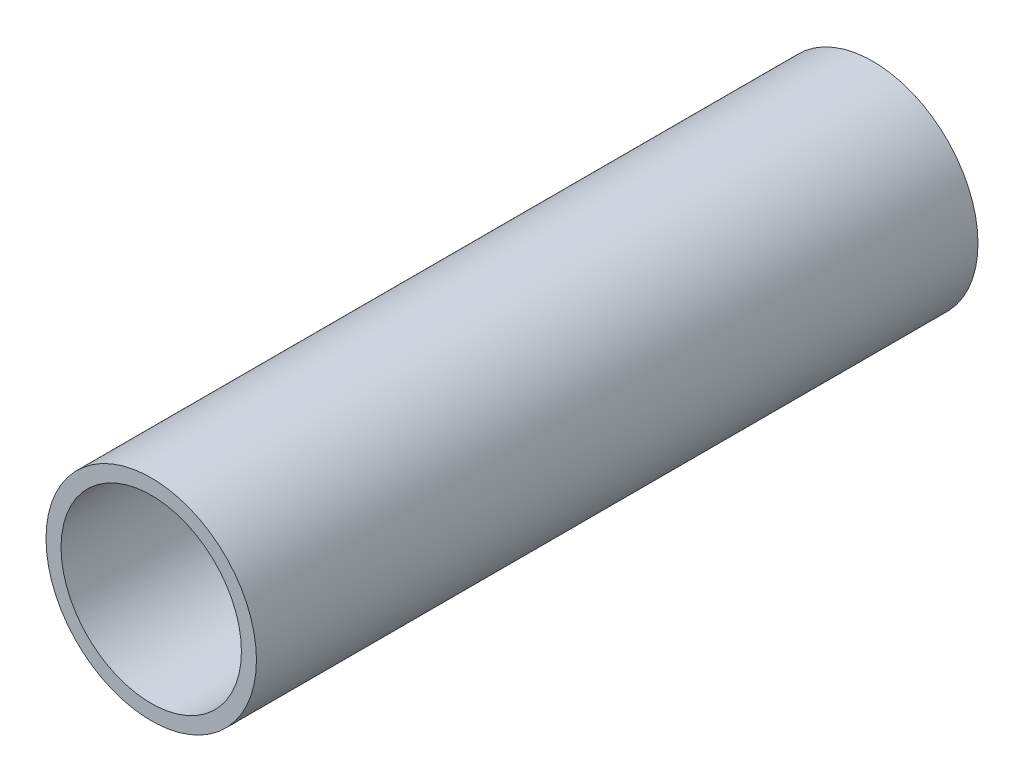
ISO-10303-21;
HEADER;
FILE_DESCRIPTION(('STEP AP214'),'2;1');
FILE_NAME('part.step','',(''),(''),'','','');
FILE_SCHEMA(('AUTOMOTIVE_DESIGN { 1 0 10303 214 1 1 1 1 }'));
ENDSEC;
DATA;
#1=APPLICATION_CONTEXT('core data for automotive mechanical design processes');
#2=APPLICATION_PROTOCOL_DEFINITION('international standard','automotive_design',2000,#1);
#3=PRODUCT_CONTEXT('',#1,'mechanical');
#4=PRODUCT('Part','Part','',(#3));
#5=PRODUCT_RELATED_PRODUCT_CATEGORY('part','',(#4));
#6=PRODUCT_DEFINITION_FORMATION('','',#4);
#7=PRODUCT_DEFINITION_CONTEXT('part definition',#1,'design');
#8=PRODUCT_DEFINITION('design','',#6,#7);
#9=PRODUCT_DEFINITION_SHAPE('','',#8);
#10=(LENGTH_UNIT() NAMED_UNIT(*) SI_UNIT(.MILLI.,.METRE.));
#11=(NAMED_UNIT(*) PLANE_ANGLE_UNIT() SI_UNIT($,.RADIAN.));
#12=(NAMED_UNIT(*) SI_UNIT($,.STERADIAN.) SOLID_ANGLE_UNIT());
#13=UNCERTAINTY_MEASURE_WITH_UNIT(LENGTH_MEASURE(1.E-05),#10,'distance_accuracy_value','');
#14=(GEOMETRIC_REPRESENTATION_CONTEXT(3) GLOBAL_UNCERTAINTY_ASSIGNED_CONTEXT((#13)) GLOBAL_UNIT_ASSIGNED_CONTEXT((#10,
#11,#12)) REPRESENTATION_CONTEXT('',''));
#15=CARTESIAN_POINT('',(0.,0.,0.));
#16=DIRECTION('',(0.,0.,1.));
#17=DIRECTION('',(1.,0.,0.));
#18=AXIS2_PLACEMENT_3D('',#15,#16,#17);
#19=CARTESIAN_POINT('',(0.,0.,304.8));
#20=DIRECTION('',(0.,0.,1.));
#21=DIRECTION('',(1.,0.,0.));
#22=AXIS2_PLACEMENT_3D('',#19,#20,#21);
#23=PLANE('',#22);
#24=CARTESIAN_POINT('',(0.,0.,304.8));
#25=DIRECTION('',(0.,0.,1.));
#26=DIRECTION('',(1.,0.,0.));
#27=AXIS2_PLACEMENT_3D('',#24,#25,#26);
#28=CIRCLE('',#27,44.45);
#29=CARTESIAN_POINT('',(-44.45,0.,304.8));
#30=VERTEX_POINT('',#29);
#31=EDGE_CURVE('E10',#30,#30,#28,.T.);
#32=ORIENTED_EDGE('',*,*,#31,.T.);
#33=EDGE_LOOP('',(#32));
#34=FACE_BOUND('',#33,.T.);
#35=CARTESIAN_POINT('',(0.,0.,304.8));
#36=DIRECTION('',(0.,0.,1.));
#37=DIRECTION('',(1.,0.,0.));
#38=AXIS2_PLACEMENT_3D('',#35,#36,#37);
#39=CIRCLE('',#38,38.1);
#40=CARTESIAN_POINT('',(-38.1,0.,304.8));
#41=VERTEX_POINT('',#40);
#42=EDGE_CURVE('E44',#41,#41,#39,.T.);
#43=ORIENTED_EDGE('',*,*,#42,.F.);
#44=EDGE_LOOP('',(#43));
#45=FACE_BOUND('',#44,.T.);
#46=ADVANCED_FACE('F33',(#34,#45),#23,.T.);
#47=CARTESIAN_POINT('',(0.,0.,0.));
#48=DIRECTION('',(0.,0.,1.));
#49=DIRECTION('',(1.,0.,0.));
#50=AXIS2_PLACEMENT_3D('',#47,#48,#49);
#51=PLANE('',#50);
#52=CARTESIAN_POINT('',(0.,0.,0.));
#53=DIRECTION('',(0.,0.,1.));
#54=DIRECTION('',(1.,0.,0.));
#55=AXIS2_PLACEMENT_3D('',#52,#53,#54);
#56=CIRCLE('',#55,44.45);
#57=CARTESIAN_POINT('',(-44.45,0.,0.));
#58=VERTEX_POINT('',#57);
#59=EDGE_CURVE('E37',#58,#58,#56,.T.);
#60=ORIENTED_EDGE('',*,*,#59,.F.);
#61=EDGE_LOOP('',(#60));
#62=FACE_BOUND('',#61,.T.);
#63=CARTESIAN_POINT('',(0.,0.,0.));
#64=DIRECTION('',(0.,0.,1.));
#65=DIRECTION('',(1.,0.,0.));
#66=AXIS2_PLACEMENT_3D('',#63,#64,#65);
#67=CIRCLE('',#66,38.1);
#68=CARTESIAN_POINT('',(-38.1,0.,0.));
#69=VERTEX_POINT('',#68);
#70=EDGE_CURVE('E46',#69,#69,#67,.T.);
#71=ORIENTED_EDGE('',*,*,#70,.T.);
#72=EDGE_LOOP('',(#71));
#73=FACE_BOUND('',#72,.T.);
#74=ADVANCED_FACE('F56',(#62,#73),#51,.F.);
#75=CARTESIAN_POINT('',(0.,0.,304.8));
#76=DIRECTION('',(0.,0.,-1.));
#77=DIRECTION('',(-1.,0.,0.));
#78=AXIS2_PLACEMENT_3D('',#75,#76,#77);
#79=CYLINDRICAL_SURFACE('',#78,44.45);
#80=CARTESIAN_POINT('',(-44.45,0.,304.8));
#81=CARTESIAN_POINT('',(-44.45,0.,301.625));
#82=CARTESIAN_POINT('',(-44.45,0.,298.45));
#83=CARTESIAN_POINT('',(-44.45,0.,292.1));
#84=CARTESIAN_POINT('',(-44.45,0.,288.925));
#85=CARTESIAN_POINT('',(-44.45,0.,282.575));
#86=CARTESIAN_POINT('',(-44.45,0.,279.4));
#87=CARTESIAN_POINT('',(-44.45,0.,273.05));
#88=CARTESIAN_POINT('',(-44.45,0.,269.875));
#89=CARTESIAN_POINT('',(-44.45,0.,263.525));
#90=CARTESIAN_POINT('',(-44.45,0.,260.35));
#91=CARTESIAN_POINT('',(-44.45,0.,254.));
#92=CARTESIAN_POINT('',(-44.45,0.,250.825));
#93=CARTESIAN_POINT('',(-44.45,0.,244.475));
#94=CARTESIAN_POINT('',(-44.45,0.,241.3));
#95=CARTESIAN_POINT('',(-44.45,0.,234.95));
#96=CARTESIAN_POINT('',(-44.45,0.,231.775));
#97=CARTESIAN_POINT('',(-44.45,0.,225.425));
#98=CARTESIAN_POINT('',(-44.45,0.,222.25));
#99=CARTESIAN_POINT('',(-44.45,0.,215.9));
#100=CARTESIAN_POINT('',(-44.45,0.,212.725));
#101=CARTESIAN_POINT('',(-44.45,0.,206.375));
#102=CARTESIAN_POINT('',(-44.45,0.,203.2));
#103=CARTESIAN_POINT('',(-44.45,0.,196.85));
#104=CARTESIAN_POINT('',(-44.45,0.,193.675));
#105=CARTESIAN_POINT('',(-44.45,0.,187.325));
#106=CARTESIAN_POINT('',(-44.45,0.,184.15));
#107=CARTESIAN_POINT('',(-44.45,0.,177.8));
#108=CARTESIAN_POINT('',(-44.45,0.,174.625));
#109=CARTESIAN_POINT('',(-44.45,0.,168.275));
#110=CARTESIAN_POINT('',(-44.45,0.,165.1));
#111=CARTESIAN_POINT('',(-44.45,0.,158.75));
#112=CARTESIAN_POINT('',(-44.45,0.,155.575));
#113=CARTESIAN_POINT('',(-44.45,0.,149.225));
#114=CARTESIAN_POINT('',(-44.45,0.,146.05));
#115=CARTESIAN_POINT('',(-44.45,0.,139.7));
#116=CARTESIAN_POINT('',(-44.45,0.,136.525));
#117=CARTESIAN_POINT('',(-44.45,0.,130.175));
#118=CARTESIAN_POINT('',(-44.45,0.,127.));
#119=CARTESIAN_POINT('',(-44.45,0.,120.65));
#120=CARTESIAN_POINT('',(-44.45,0.,117.475));
#121=CARTESIAN_POINT('',(-44.45,0.,111.125));
#122=CARTESIAN_POINT('',(-44.45,0.,107.95));
#123=CARTESIAN_POINT('',(-44.45,0.,101.6));
#124=CARTESIAN_POINT('',(-44.45,0.,98.425));
#125=CARTESIAN_POINT('',(-44.45,0.,92.075));
#126=CARTESIAN_POINT('',(-44.45,0.,88.9));
#127=CARTESIAN_POINT('',(-44.45,0.,82.55));
#128=CARTESIAN_POINT('',(-44.45,0.,79.375));
#129=CARTESIAN_POINT('',(-44.45,0.,73.025));
#130=CARTESIAN_POINT('',(-44.45,0.,69.85));
#131=CARTESIAN_POINT('',(-44.45,0.,63.5));
#132=CARTESIAN_POINT('',(-44.45,0.,60.325));
#133=CARTESIAN_POINT('',(-44.45,0.,53.975));
#134=CARTESIAN_POINT('',(-44.45,0.,50.8));
#135=CARTESIAN_POINT('',(-44.45,0.,44.45));
#136=CARTESIAN_POINT('',(-44.45,0.,41.275));
#137=CARTESIAN_POINT('',(-44.45,0.,34.925));
#138=CARTESIAN_POINT('',(-44.45,0.,31.75));
#139=CARTESIAN_POINT('',(-44.45,0.,25.4));
#140=CARTESIAN_POINT('',(-44.45,0.,22.225));
#141=CARTESIAN_POINT('',(-44.45,0.,15.875));
#142=CARTESIAN_POINT('',(-44.45,0.,12.7));
#143=CARTESIAN_POINT('',(-44.45,0.,6.35));
#144=CARTESIAN_POINT('',(-44.45,0.,3.175));
#145=CARTESIAN_POINT('',(-44.45,0.,0.));
#146=B_SPLINE_CURVE_WITH_KNOTS('',3,(#80,#81,#82,#83,#84,#85,#86,#87,#88,#89,#90,#91,#92,#93,
#94,#95,#96,#97,#98,#99,#100,#101,#102,#103,#104,#105,#106,#107,#108,#109,#110,#111,#112,#113,
#114,#115,#116,#117,#118,#119,#120,#121,#122,#123,#124,#125,#126,#127,#128,#129,#130,#131,#132,
#133,#134,#135,#136,#137,#138,#139,#140,#141,#142,#143,#144,#145),.UNSPECIFIED.,.F.,.F.,(4,2,2,
2,2,2,2,2,2,2,2,2,2,2,2,2,2,2,2,2,2,2,2,2,2,2,2,2,2,2,2,2,4),(0.,9.52499999999995,19.05,28.575,
38.1,47.625,57.15,66.675,76.2,85.725,95.2499999999999,104.775,114.3,123.825,133.35,142.875,
152.4,161.925,171.45,180.975,190.5,200.025,209.55,219.075,228.6,238.125,247.65,257.175,266.7,
276.225,285.75,295.275,304.8),.UNSPECIFIED.);
#147=EDGE_CURVE('BSEAM35',#30,#58,#146,.T.);
#148=ORIENTED_EDGE('',*,*,#31,.F.);
#149=ORIENTED_EDGE('',*,*,#59,.T.);
#150=ORIENTED_EDGE('',*,*,#147,.T.);
#151=ORIENTED_EDGE('',*,*,#147,.F.);
#152=EDGE_LOOP('',(#148,#150,#149,#151));
#153=FACE_BOUND('',#152,.T.);
#154=ADVANCED_FACE('F35',(#153),#79,.T.);
#155=CARTESIAN_POINT('',(0.,0.,304.8));
#156=DIRECTION('',(0.,0.,-1.));
#157=DIRECTION('',(-1.,0.,0.));
#158=AXIS2_PLACEMENT_3D('',#155,#156,#157);
#159=CYLINDRICAL_SURFACE('',#158,38.1);
#160=CARTESIAN_POINT('',(-38.1,0.,304.8));
#161=CARTESIAN_POINT('',(-38.1,0.,301.625));
#162=CARTESIAN_POINT('',(-38.1,0.,298.45));
#163=CARTESIAN_POINT('',(-38.1,0.,292.1));
#164=CARTESIAN_POINT('',(-38.1,0.,288.925));
#165=CARTESIAN_POINT('',(-38.1,0.,282.575));
#166=CARTESIAN_POINT('',(-38.1,0.,279.4));
#167=CARTESIAN_POINT('',(-38.1,0.,273.05));
#168=CARTESIAN_POINT('',(-38.1,0.,269.875));
#169=CARTESIAN_POINT('',(-38.1,0.,263.525));
#170=CARTESIAN_POINT('',(-38.1,0.,260.35));
#171=CARTESIAN_POINT('',(-38.1,0.,254.));
#172=CARTESIAN_POINT('',(-38.1,0.,250.825));
#173=CARTESIAN_POINT('',(-38.1,0.,244.475));
#174=CARTESIAN_POINT('',(-38.1,0.,241.3));
#175=CARTESIAN_POINT('',(-38.1,0.,234.95));
#176=CARTESIAN_POINT('',(-38.1,0.,231.775));
#177=CARTESIAN_POINT('',(-38.1,0.,225.425));
#178=CARTESIAN_POINT('',(-38.1,0.,222.25));
#179=CARTESIAN_POINT('',(-38.1,0.,215.9));
#180=CARTESIAN_POINT('',(-38.1,0.,212.725));
#181=CARTESIAN_POINT('',(-38.1,0.,206.375));
#182=CARTESIAN_POINT('',(-38.1,0.,203.2));
#183=CARTESIAN_POINT('',(-38.1,0.,196.85));
#184=CARTESIAN_POINT('',(-38.1,0.,193.675));
#185=CARTESIAN_POINT('',(-38.1,0.,187.325));
#186=CARTESIAN_POINT('',(-38.1,0.,184.15));
#187=CARTESIAN_POINT('',(-38.1,0.,177.8));
#188=CARTESIAN_POINT('',(-38.1,0.,174.625));
#189=CARTESIAN_POINT('',(-38.1,0.,168.275));
#190=CARTESIAN_POINT('',(-38.1,0.,165.1));
#191=CARTESIAN_POINT('',(-38.1,0.,158.75));
#192=CARTESIAN_POINT('',(-38.1,0.,155.575));
#193=CARTESIAN_POINT('',(-38.1,0.,149.225));
#194=CARTESIAN_POINT('',(-38.1,0.,146.05));
#195=CARTESIAN_POINT('',(-38.1,0.,139.7));
#196=CARTESIAN_POINT('',(-38.1,0.,136.525));
#197=CARTESIAN_POINT('',(-38.1,0.,130.175));
#198=CARTESIAN_POINT('',(-38.1,0.,127.));
#199=CARTESIAN_POINT('',(-38.1,0.,120.65));
#200=CARTESIAN_POINT('',(-38.1,0.,117.475));
#201=CARTESIAN_POINT('',(-38.1,0.,111.125));
#202=CARTESIAN_POINT('',(-38.1,0.,107.95));
#203=CARTESIAN_POINT('',(-38.1,0.,101.6));
#204=CARTESIAN_POINT('',(-38.1,0.,98.425));
#205=CARTESIAN_POINT('',(-38.1,0.,92.075));
#206=CARTESIAN_POINT('',(-38.1,0.,88.9));
#207=CARTESIAN_POINT('',(-38.1,0.,82.55));
#208=CARTESIAN_POINT('',(-38.1,0.,79.375));
#209=CARTESIAN_POINT('',(-38.1,0.,73.025));
#210=CARTESIAN_POINT('',(-38.1,0.,69.85));
#211=CARTESIAN_POINT('',(-38.1,0.,63.5));
#212=CARTESIAN_POINT('',(-38.1,0.,60.325));
#213=CARTESIAN_POINT('',(-38.1,0.,53.975));
#214=CARTESIAN_POINT('',(-38.1,0.,50.8));
#215=CARTESIAN_POINT('',(-38.1,0.,44.45));
#216=CARTESIAN_POINT('',(-38.1,0.,41.275));
#217=CARTESIAN_POINT('',(-38.1,0.,34.925));
#218=CARTESIAN_POINT('',(-38.1,0.,31.75));
#219=CARTESIAN_POINT('',(-38.1,0.,25.4));
#220=CARTESIAN_POINT('',(-38.1,0.,22.225));
#221=CARTESIAN_POINT('',(-38.1,0.,15.875));
#222=CARTESIAN_POINT('',(-38.1,0.,12.7));
#223=CARTESIAN_POINT('',(-38.1,0.,6.35));
#224=CARTESIAN_POINT('',(-38.1,0.,3.175));
#225=CARTESIAN_POINT('',(-38.1,0.,0.));
#226=B_SPLINE_CURVE_WITH_KNOTS('',3,(#160,#161,#162,#163,#164,#165,#166,#167,#168,#169,#170,
#171,#172,#173,#174,#175,#176,#177,#178,#179,#180,#181,#182,#183,#184,#185,#186,#187,#188,#189,
#190,#191,#192,#193,#194,#195,#196,#197,#198,#199,#200,#201,#202,#203,#204,#205,#206,#207,#208,
#209,#210,#211,#212,#213,#214,#215,#216,#217,#218,#219,#220,#221,#222,#223,#224,#225),
.UNSPECIFIED.,.F.,.F.,(4,2,2,2,2,2,2,2,2,2,2,2,2,2,2,2,2,2,2,2,2,2,2,2,2,2,2,2,2,2,2,2,4),(0.,
9.52500000000001,19.05,28.575,38.1,47.625,57.15,66.675,76.2,85.7250000000001,95.2500000000001,
104.775,114.3,123.825,133.35,142.875,152.4,161.925,171.45,180.975,190.5,200.025,209.55,219.075,
228.6,238.125,247.65,257.175,266.7,276.225,285.75,295.275,304.8),.UNSPECIFIED.);
#227=EDGE_CURVE('BSEAM52',#41,#69,#226,.T.);
#228=ORIENTED_EDGE('',*,*,#42,.T.);
#229=ORIENTED_EDGE('',*,*,#70,.F.);
#230=ORIENTED_EDGE('',*,*,#227,.T.);
#231=ORIENTED_EDGE('',*,*,#227,.F.);
#232=EDGE_LOOP('',(#228,#230,#229,#231));
#233=FACE_BOUND('',#232,.T.);
#234=ADVANCED_FACE('F52',(#233),#159,.F.);
#235=CLOSED_SHELL('',(#46,#74,#154,#234));
#236=MANIFOLD_SOLID_BREP('B2',#235);
#237=ADVANCED_BREP_SHAPE_REPRESENTATION('',(#18,#236),#14);
#238=SHAPE_DEFINITION_REPRESENTATION(#9,#237);
ENDSEC;
END-ISO-10303-21;
